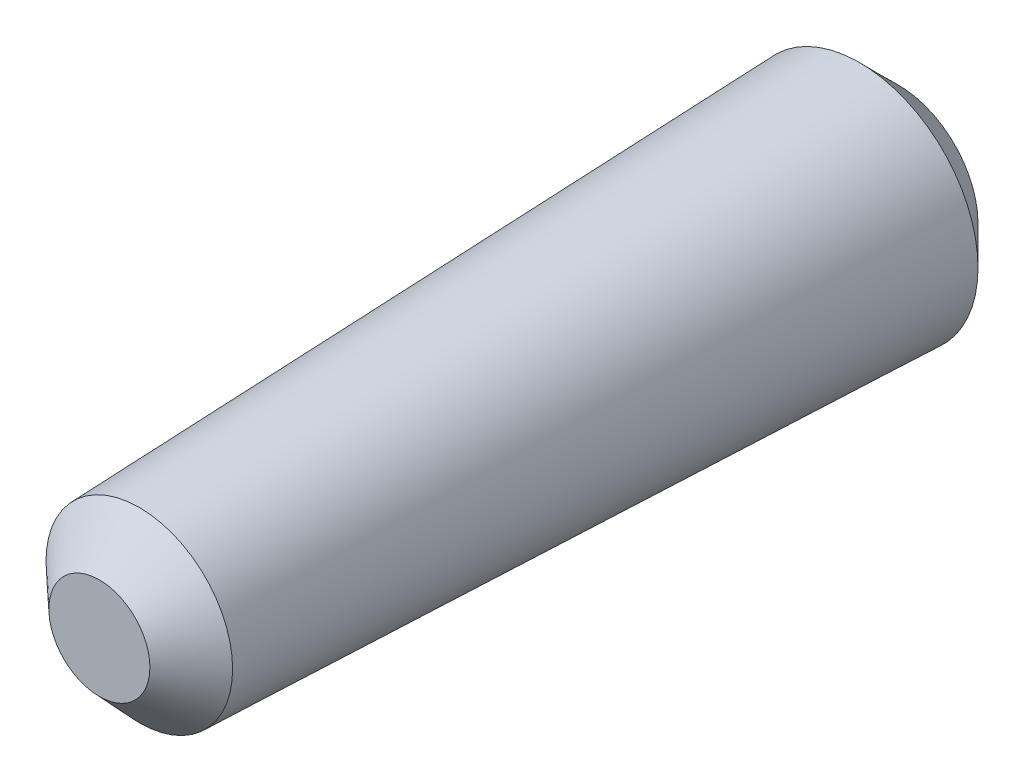
ISO-10303-21;
HEADER;
FILE_DESCRIPTION(('STEP AP214'),'2;1');
FILE_NAME('part.step','',(''),(''),'','','');
FILE_SCHEMA(('AUTOMOTIVE_DESIGN { 1 0 10303 214 1 1 1 1 }'));
ENDSEC;
DATA;
#1=APPLICATION_CONTEXT('core data for automotive mechanical design processes');
#2=APPLICATION_PROTOCOL_DEFINITION('international standard','automotive_design',2000,#1);
#3=PRODUCT_CONTEXT('',#1,'mechanical');
#4=PRODUCT('Part','Part','',(#3));
#5=PRODUCT_RELATED_PRODUCT_CATEGORY('part','',(#4));
#6=PRODUCT_DEFINITION_FORMATION('','',#4);
#7=PRODUCT_DEFINITION_CONTEXT('part definition',#1,'design');
#8=PRODUCT_DEFINITION('design','',#6,#7);
#9=PRODUCT_DEFINITION_SHAPE('','',#8);
#10=(LENGTH_UNIT() NAMED_UNIT(*) SI_UNIT(.MILLI.,.METRE.));
#11=(NAMED_UNIT(*) PLANE_ANGLE_UNIT() SI_UNIT($,.RADIAN.));
#12=(NAMED_UNIT(*) SI_UNIT($,.STERADIAN.) SOLID_ANGLE_UNIT());
#13=UNCERTAINTY_MEASURE_WITH_UNIT(LENGTH_MEASURE(1.E-05),#10,'distance_accuracy_value','');
#14=(GEOMETRIC_REPRESENTATION_CONTEXT(3) GLOBAL_UNCERTAINTY_ASSIGNED_CONTEXT((#13)) GLOBAL_UNIT_ASSIGNED_CONTEXT((#10,
#11,#12)) REPRESENTATION_CONTEXT('',''));
#15=CARTESIAN_POINT('',(0.,0.,0.));
#16=DIRECTION('',(0.,0.,1.));
#17=DIRECTION('',(1.,0.,0.));
#18=AXIS2_PLACEMENT_3D('',#15,#16,#17);
#19=CARTESIAN_POINT('',(0.,0.,0.));
#20=DIRECTION('',(0.,0.,-1.));
#21=DIRECTION('',(1.,0.,0.));
#22=AXIS2_PLACEMENT_3D('',#19,#20,#21);
#23=CONICAL_SURFACE('',#22,3.,0.0349065850398867);
#24=CARTESIAN_POINT('',(0.,0.,0.96625754306881));
#25=DIRECTION('',(0.,0.,1.));
#26=DIRECTION('',(1.,0.,0.));
#27=AXIS2_PLACEMENT_3D('',#24,#25,#26);
#28=CIRCLE('',#27,2.96625754306883);
#29=CARTESIAN_POINT('',(2.96625754306883,0.,0.96625754306881));
#30=VERTEX_POINT('',#29);
#31=EDGE_CURVE('E57',#30,#30,#28,.T.);
#32=ORIENTED_EDGE('',*,*,#31,.T.);
#33=EDGE_LOOP('',(#32));
#34=FACE_BOUND('',#33,.T.);
#35=CARTESIAN_POINT('',(0.,0.,19.0006091729809));
#36=DIRECTION('',(0.,0.,-1.));
#37=DIRECTION('',(-1.,0.,0.));
#38=AXIS2_PLACEMENT_3D('',#35,#36,#37);
#39=CIRCLE('',#38,2.33648410686755);
#40=CARTESIAN_POINT('',(-2.33648410686755,0.,19.0006091729809));
#41=VERTEX_POINT('',#40);
#42=EDGE_CURVE('E62',#41,#41,#39,.T.);
#43=ORIENTED_EDGE('',*,*,#42,.T.);
#44=EDGE_LOOP('',(#43));
#45=FACE_BOUND('',#44,.T.);
#46=ADVANCED_FACE('F43',(#34,#45),#23,.T.);
#47=CARTESIAN_POINT('',(0.,0.,20.));
#48=DIRECTION('',(0.,0.,1.));
#49=DIRECTION('',(1.,0.,0.));
#50=AXIS2_PLACEMENT_3D('',#47,#48,#49);
#51=PLANE('',#50);
#52=CARTESIAN_POINT('',(0.,0.,20.));
#53=DIRECTION('',(0.,0.,1.));
#54=DIRECTION('',(1.,0.,0.));
#55=AXIS2_PLACEMENT_3D('',#52,#53,#54);
#56=CIRCLE('',#55,1.26476865488659);
#57=CARTESIAN_POINT('',(1.26476865488659,0.,20.));
#58=VERTEX_POINT('',#57);
#59=EDGE_CURVE('E10',#58,#58,#56,.T.);
#60=ORIENTED_EDGE('',*,*,#59,.T.);
#61=EDGE_LOOP('',(#60));
#62=FACE_BOUND('',#61,.T.);
#63=ADVANCED_FACE('F79',(#62),#51,.T.);
#64=CARTESIAN_POINT('',(0.,0.,0.));
#65=DIRECTION('',(0.,0.,1.));
#66=DIRECTION('',(1.,0.,0.));
#67=AXIS2_PLACEMENT_3D('',#64,#65,#66);
#68=PLANE('',#67);
#69=CARTESIAN_POINT('',(0.,0.,0.));
#70=DIRECTION('',(0.,0.,1.));
#71=DIRECTION('',(1.,0.,0.));
#72=AXIS2_PLACEMENT_3D('',#69,#70,#71);
#73=CIRCLE('',#72,1.99999999999999);
#74=CARTESIAN_POINT('',(1.99999999999999,0.,0.));
#75=VERTEX_POINT('',#74);
#76=EDGE_CURVE('E52',#75,#75,#73,.F.);
#77=ORIENTED_EDGE('',*,*,#76,.T.);
#78=EDGE_LOOP('',(#77));
#79=FACE_BOUND('',#78,.T.);
#80=ADVANCED_FACE('F76',(#79),#68,.F.);
#81=CARTESIAN_POINT('',(0.,0.,0.966257543068834));
#82=DIRECTION('',(0.,0.,1.));
#83=DIRECTION('',(1.,0.,0.));
#84=AXIS2_PLACEMENT_3D('',#81,#82,#83);
#85=CONICAL_SURFACE('',#84,2.96625754306883,0.78539816339745);
#86=ORIENTED_EDGE('',*,*,#76,.F.);
#87=EDGE_LOOP('',(#86));
#88=FACE_BOUND('',#87,.T.);
#89=ORIENTED_EDGE('',*,*,#31,.F.);
#90=EDGE_LOOP('',(#89));
#91=FACE_BOUND('',#90,.T.);
#92=ADVANCED_FACE('F72',(#88,#91),#85,.T.);
#93=CARTESIAN_POINT('',(0.,0.,20.));
#94=DIRECTION('',(0.,0.,-1.));
#95=DIRECTION('',(-1.,0.,0.));
#96=AXIS2_PLACEMENT_3D('',#93,#94,#95);
#97=CONICAL_SURFACE('',#96,1.26476865488659,0.820304748437332);
#98=ORIENTED_EDGE('',*,*,#42,.F.);
#99=EDGE_LOOP('',(#98));
#100=FACE_BOUND('',#99,.T.);
#101=ORIENTED_EDGE('',*,*,#59,.F.);
#102=EDGE_LOOP('',(#101));
#103=FACE_BOUND('',#102,.T.);
#104=ADVANCED_FACE('F46',(#100,#103),#97,.T.);
#105=CLOSED_SHELL('',(#46,#63,#80,#92,#104));
#106=MANIFOLD_SOLID_BREP('B2',#105);
#107=ADVANCED_BREP_SHAPE_REPRESENTATION('',(#18,#106),#14);
#108=SHAPE_DEFINITION_REPRESENTATION(#9,#107);
ENDSEC;
END-ISO-10303-21;
